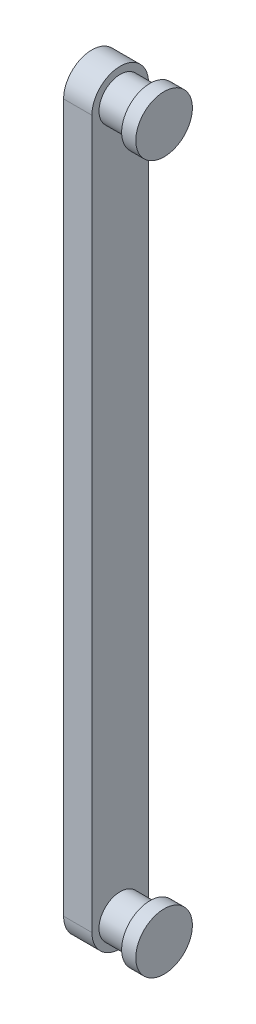
ISO-10303-21;
HEADER;
FILE_DESCRIPTION(('STEP AP214'),'2;1');
FILE_NAME('part.step','',(''),(''),'','','');
FILE_SCHEMA(('AUTOMOTIVE_DESIGN { 1 0 10303 214 1 1 1 1 }'));
ENDSEC;
DATA;
#1=APPLICATION_CONTEXT('core data for automotive mechanical design processes');
#2=APPLICATION_PROTOCOL_DEFINITION('international standard','automotive_design',2000,#1);
#3=PRODUCT_CONTEXT('',#1,'mechanical');
#4=PRODUCT('Part','Part','',(#3));
#5=PRODUCT_RELATED_PRODUCT_CATEGORY('part','',(#4));
#6=PRODUCT_DEFINITION_FORMATION('','',#4);
#7=PRODUCT_DEFINITION_CONTEXT('part definition',#1,'design');
#8=PRODUCT_DEFINITION('design','',#6,#7);
#9=PRODUCT_DEFINITION_SHAPE('','',#8);
#10=(LENGTH_UNIT() NAMED_UNIT(*) SI_UNIT(.MILLI.,.METRE.));
#11=(NAMED_UNIT(*) PLANE_ANGLE_UNIT() SI_UNIT($,.RADIAN.));
#12=(NAMED_UNIT(*) SI_UNIT($,.STERADIAN.) SOLID_ANGLE_UNIT());
#13=UNCERTAINTY_MEASURE_WITH_UNIT(LENGTH_MEASURE(1.E-05),#10,'distance_accuracy_value','');
#14=(GEOMETRIC_REPRESENTATION_CONTEXT(3) GLOBAL_UNCERTAINTY_ASSIGNED_CONTEXT((#13)) GLOBAL_UNIT_ASSIGNED_CONTEXT((#10,
#11,#12)) REPRESENTATION_CONTEXT('',''));
#15=CARTESIAN_POINT('',(0.,0.,0.));
#16=DIRECTION('',(0.,0.,1.));
#17=DIRECTION('',(1.,0.,0.));
#18=AXIS2_PLACEMENT_3D('',#15,#16,#17);
#19=CARTESIAN_POINT('',(2.,-25.,0.));
#20=DIRECTION('',(-1.,0.,0.));
#21=DIRECTION('',(0.,0.,1.));
#22=AXIS2_PLACEMENT_3D('',#19,#20,#21);
#23=PLANE('',#22);
#24=CARTESIAN_POINT('',(2.,-25.,0.));
#25=DIRECTION('',(-1.,0.,0.));
#26=DIRECTION('',(0.,0.,-1.));
#27=AXIS2_PLACEMENT_3D('',#24,#25,#26);
#28=CIRCLE('',#27,1.5);
#29=CARTESIAN_POINT('',(2.,-25.,-1.5));
#30=VERTEX_POINT('',#29);
#31=EDGE_CURVE('E166',#30,#30,#28,.T.);
#32=ORIENTED_EDGE('',*,*,#31,.T.);
#33=EDGE_LOOP('',(#32));
#34=FACE_BOUND('',#33,.T.);
#35=CARTESIAN_POINT('',(2.,-25.,0.));
#36=DIRECTION('',(1.,0.,0.));
#37=DIRECTION('',(0.,0.,1.));
#38=AXIS2_PLACEMENT_3D('',#35,#36,#37);
#39=CIRCLE('',#38,2.);
#40=CARTESIAN_POINT('',(2.,-25.,2.));
#41=VERTEX_POINT('',#40);
#42=CARTESIAN_POINT('',(2.,-25.,-2.));
#43=VERTEX_POINT('',#42);
#44=EDGE_CURVE('E85',#41,#43,#39,.T.);
#45=ORIENTED_EDGE('',*,*,#44,.T.);
#46=DIRECTION('',(0.,1.,0.));
#47=VECTOR('',#46,1.);
#48=CARTESIAN_POINT('',(2.,25.,-2.));
#49=LINE('',#48,#47);
#50=CARTESIAN_POINT('',(2.,25.,-2.));
#51=VERTEX_POINT('',#50);
#52=EDGE_CURVE('E80',#43,#51,#49,.T.);
#53=ORIENTED_EDGE('',*,*,#52,.T.);
#54=CARTESIAN_POINT('',(2.,25.,0.));
#55=DIRECTION('',(1.,0.,0.));
#56=DIRECTION('',(0.,0.,-1.));
#57=AXIS2_PLACEMENT_3D('',#54,#55,#56);
#58=CIRCLE('',#57,2.);
#59=CARTESIAN_POINT('',(2.,25.,2.));
#60=VERTEX_POINT('',#59);
#61=EDGE_CURVE('E83',#51,#60,#58,.T.);
#62=ORIENTED_EDGE('',*,*,#61,.T.);
#63=DIRECTION('',(0.,-1.,0.));
#64=VECTOR('',#63,1.);
#65=CARTESIAN_POINT('',(2.,25.,2.));
#66=LINE('',#65,#64);
#67=EDGE_CURVE('E49',#60,#41,#66,.T.);
#68=ORIENTED_EDGE('',*,*,#67,.T.);
#69=EDGE_LOOP('',(#45,#53,#62,#68));
#70=FACE_BOUND('',#69,.T.);
#71=CARTESIAN_POINT('',(2.,25.,0.));
#72=DIRECTION('',(-1.,0.,0.));
#73=DIRECTION('',(0.,0.,1.));
#74=AXIS2_PLACEMENT_3D('',#71,#72,#73);
#75=CIRCLE('',#74,1.5);
#76=CARTESIAN_POINT('',(2.,25.,1.5));
#77=VERTEX_POINT('',#76);
#78=EDGE_CURVE('E11',#77,#77,#75,.F.);
#79=ORIENTED_EDGE('',*,*,#78,.F.);
#80=EDGE_LOOP('',(#79));
#81=FACE_BOUND('',#80,.T.);
#82=ADVANCED_FACE('F32',(#34,#70,#81),#23,.F.);
#83=CARTESIAN_POINT('',(2.,-25.,0.));
#84=DIRECTION('',(-1.,0.,0.));
#85=DIRECTION('',(0.,0.,1.));
#86=AXIS2_PLACEMENT_3D('',#83,#84,#85);
#87=CYLINDRICAL_SURFACE('',#86,2.);
#88=CARTESIAN_POINT('',(0.,-25.,0.));
#89=DIRECTION('',(1.,0.,0.));
#90=DIRECTION('',(0.,0.,1.));
#91=AXIS2_PLACEMENT_3D('',#88,#89,#90);
#92=CIRCLE('',#91,2.);
#93=CARTESIAN_POINT('',(0.,-25.,2.));
#94=VERTEX_POINT('',#93);
#95=CARTESIAN_POINT('',(0.,-25.,-2.));
#96=VERTEX_POINT('',#95);
#97=EDGE_CURVE('E99',#94,#96,#92,.T.);
#98=ORIENTED_EDGE('',*,*,#97,.T.);
#99=DIRECTION('',(-1.,0.,0.));
#100=VECTOR('',#99,1.);
#101=CARTESIAN_POINT('',(2.,-25.,-2.));
#102=LINE('',#101,#100);
#103=EDGE_CURVE('E41',#43,#96,#102,.T.);
#104=ORIENTED_EDGE('',*,*,#103,.F.);
#105=ORIENTED_EDGE('',*,*,#44,.F.);
#106=DIRECTION('',(-1.,0.,0.));
#107=VECTOR('',#106,1.);
#108=CARTESIAN_POINT('',(2.,-25.,2.));
#109=LINE('',#108,#107);
#110=EDGE_CURVE('E95',#41,#94,#109,.T.);
#111=ORIENTED_EDGE('',*,*,#110,.T.);
#112=EDGE_LOOP('',(#98,#104,#105,#111));
#113=FACE_BOUND('',#112,.T.);
#114=ADVANCED_FACE('F34',(#113),#87,.T.);
#115=CARTESIAN_POINT('',(2.,25.,-2.));
#116=DIRECTION('',(0.,0.,1.));
#117=DIRECTION('',(0.,-1.,0.));
#118=AXIS2_PLACEMENT_3D('',#115,#116,#117);
#119=PLANE('',#118);
#120=DIRECTION('',(0.,1.,0.));
#121=VECTOR('',#120,1.);
#122=CARTESIAN_POINT('',(0.,25.,-2.));
#123=LINE('',#122,#121);
#124=CARTESIAN_POINT('',(0.,25.,-2.));
#125=VERTEX_POINT('',#124);
#126=EDGE_CURVE('E90',#96,#125,#123,.T.);
#127=ORIENTED_EDGE('',*,*,#126,.T.);
#128=DIRECTION('',(-1.,0.,0.));
#129=VECTOR('',#128,1.);
#130=CARTESIAN_POINT('',(2.,25.,-2.));
#131=LINE('',#130,#129);
#132=EDGE_CURVE('E88',#51,#125,#131,.T.);
#133=ORIENTED_EDGE('',*,*,#132,.F.);
#134=ORIENTED_EDGE('',*,*,#52,.F.);
#135=ORIENTED_EDGE('',*,*,#103,.T.);
#136=EDGE_LOOP('',(#127,#133,#134,#135));
#137=FACE_BOUND('',#136,.T.);
#138=ADVANCED_FACE('F89',(#137),#119,.F.);
#139=CARTESIAN_POINT('',(2.,25.,0.));
#140=DIRECTION('',(-1.,0.,0.));
#141=DIRECTION('',(0.,0.,1.));
#142=AXIS2_PLACEMENT_3D('',#139,#140,#141);
#143=CYLINDRICAL_SURFACE('',#142,2.);
#144=CARTESIAN_POINT('',(0.,25.,0.));
#145=DIRECTION('',(1.,0.,0.));
#146=DIRECTION('',(0.,0.,-1.));
#147=AXIS2_PLACEMENT_3D('',#144,#145,#146);
#148=CIRCLE('',#147,2.);
#149=CARTESIAN_POINT('',(0.,25.,2.));
#150=VERTEX_POINT('',#149);
#151=EDGE_CURVE('E66',#125,#150,#148,.T.);
#152=ORIENTED_EDGE('',*,*,#151,.T.);
#153=DIRECTION('',(-1.,0.,0.));
#154=VECTOR('',#153,1.);
#155=CARTESIAN_POINT('',(2.,25.,2.));
#156=LINE('',#155,#154);
#157=EDGE_CURVE('E91',#60,#150,#156,.T.);
#158=ORIENTED_EDGE('',*,*,#157,.F.);
#159=ORIENTED_EDGE('',*,*,#61,.F.);
#160=ORIENTED_EDGE('',*,*,#132,.T.);
#161=EDGE_LOOP('',(#152,#158,#159,#160));
#162=FACE_BOUND('',#161,.T.);
#163=ADVANCED_FACE('F93',(#162),#143,.T.);
#164=CARTESIAN_POINT('',(2.,25.,2.));
#165=DIRECTION('',(0.,0.,-1.));
#166=DIRECTION('',(0.,1.,0.));
#167=AXIS2_PLACEMENT_3D('',#164,#165,#166);
#168=PLANE('',#167);
#169=DIRECTION('',(0.,-1.,0.));
#170=VECTOR('',#169,1.);
#171=CARTESIAN_POINT('',(0.,25.,2.));
#172=LINE('',#171,#170);
#173=EDGE_CURVE('E72',#150,#94,#172,.T.);
#174=ORIENTED_EDGE('',*,*,#173,.T.);
#175=ORIENTED_EDGE('',*,*,#110,.F.);
#176=ORIENTED_EDGE('',*,*,#67,.F.);
#177=ORIENTED_EDGE('',*,*,#157,.T.);
#178=EDGE_LOOP('',(#174,#175,#176,#177));
#179=FACE_BOUND('',#178,.T.);
#180=ADVANCED_FACE('F113',(#179),#168,.F.);
#181=CARTESIAN_POINT('',(0.,-25.,0.));
#182=DIRECTION('',(-1.,0.,0.));
#183=DIRECTION('',(0.,0.,1.));
#184=AXIS2_PLACEMENT_3D('',#181,#182,#183);
#185=PLANE('',#184);
#186=ORIENTED_EDGE('',*,*,#97,.F.);
#187=ORIENTED_EDGE('',*,*,#173,.F.);
#188=ORIENTED_EDGE('',*,*,#151,.F.);
#189=ORIENTED_EDGE('',*,*,#126,.F.);
#190=EDGE_LOOP('',(#186,#187,#188,#189));
#191=FACE_BOUND('',#190,.T.);
#192=ADVANCED_FACE('F110',(#191),#185,.T.);
#193=CARTESIAN_POINT('',(4.1,25.,0.));
#194=DIRECTION('',(-1.,0.,0.));
#195=DIRECTION('',(0.,0.,1.));
#196=AXIS2_PLACEMENT_3D('',#193,#194,#195);
#197=CYLINDRICAL_SURFACE('',#196,1.5);
#198=CARTESIAN_POINT('',(4.1,25.,0.));
#199=DIRECTION('',(1.,0.,0.));
#200=DIRECTION('',(0.,0.,-1.));
#201=AXIS2_PLACEMENT_3D('',#198,#199,#200);
#202=CIRCLE('',#201,1.5);
#203=CARTESIAN_POINT('',(4.1,25.,-1.5));
#204=VERTEX_POINT('',#203);
#205=EDGE_CURVE('E102',#204,#204,#202,.T.);
#206=ORIENTED_EDGE('',*,*,#205,.F.);
#207=EDGE_LOOP('',(#206));
#208=FACE_BOUND('',#207,.T.);
#209=ORIENTED_EDGE('',*,*,#78,.T.);
#210=EDGE_LOOP('',(#209));
#211=FACE_BOUND('',#210,.T.);
#212=ADVANCED_FACE('F112',(#208,#211),#197,.T.);
#213=CARTESIAN_POINT('',(4.1,25.,0.));
#214=DIRECTION('',(1.,0.,0.));
#215=DIRECTION('',(0.,0.,-1.));
#216=AXIS2_PLACEMENT_3D('',#213,#214,#215);
#217=PLANE('',#216);
#218=CARTESIAN_POINT('',(4.1,25.,0.));
#219=DIRECTION('',(1.,0.,0.));
#220=DIRECTION('',(0.,0.,-1.));
#221=AXIS2_PLACEMENT_3D('',#218,#219,#220);
#222=CIRCLE('',#221,2.);
#223=CARTESIAN_POINT('',(4.1,25.,-2.));
#224=VERTEX_POINT('',#223);
#225=EDGE_CURVE('E172',#224,#224,#222,.T.);
#226=ORIENTED_EDGE('',*,*,#225,.F.);
#227=EDGE_LOOP('',(#226));
#228=FACE_BOUND('',#227,.T.);
#229=ORIENTED_EDGE('',*,*,#205,.T.);
#230=EDGE_LOOP('',(#229));
#231=FACE_BOUND('',#230,.T.);
#232=ADVANCED_FACE('F119',(#228,#231),#217,.F.);
#233=CARTESIAN_POINT('',(5.1,25.,0.));
#234=DIRECTION('',(-1.,0.,0.));
#235=DIRECTION('',(0.,0.,1.));
#236=AXIS2_PLACEMENT_3D('',#233,#234,#235);
#237=CYLINDRICAL_SURFACE('',#236,2.);
#238=CARTESIAN_POINT('',(5.1,25.,0.));
#239=DIRECTION('',(1.,0.,0.));
#240=DIRECTION('',(0.,0.,-1.));
#241=AXIS2_PLACEMENT_3D('',#238,#239,#240);
#242=CIRCLE('',#241,2.);
#243=CARTESIAN_POINT('',(5.1,25.,-2.));
#244=VERTEX_POINT('',#243);
#245=EDGE_CURVE('E173',#244,#244,#242,.T.);
#246=ORIENTED_EDGE('',*,*,#245,.F.);
#247=EDGE_LOOP('',(#246));
#248=FACE_BOUND('',#247,.T.);
#249=ORIENTED_EDGE('',*,*,#225,.T.);
#250=EDGE_LOOP('',(#249));
#251=FACE_BOUND('',#250,.T.);
#252=ADVANCED_FACE('F131',(#248,#251),#237,.T.);
#253=CARTESIAN_POINT('',(5.1,25.,0.));
#254=DIRECTION('',(1.,0.,0.));
#255=DIRECTION('',(0.,0.,-1.));
#256=AXIS2_PLACEMENT_3D('',#253,#254,#255);
#257=PLANE('',#256);
#258=ORIENTED_EDGE('',*,*,#245,.T.);
#259=EDGE_LOOP('',(#258));
#260=FACE_BOUND('',#259,.T.);
#261=ADVANCED_FACE('F134',(#260),#257,.T.);
#262=CARTESIAN_POINT('',(4.1,-25.,0.));
#263=DIRECTION('',(-1.,0.,0.));
#264=DIRECTION('',(0.,0.,1.));
#265=AXIS2_PLACEMENT_3D('',#262,#263,#264);
#266=CYLINDRICAL_SURFACE('',#265,1.5);
#267=CARTESIAN_POINT('',(4.1,-25.,0.));
#268=DIRECTION('',(1.,0.,0.));
#269=DIRECTION('',(0.,0.,-1.));
#270=AXIS2_PLACEMENT_3D('',#267,#268,#269);
#271=CIRCLE('',#270,1.5);
#272=CARTESIAN_POINT('',(4.1,-25.,-1.5));
#273=VERTEX_POINT('',#272);
#274=EDGE_CURVE('E162',#273,#273,#271,.F.);
#275=ORIENTED_EDGE('',*,*,#274,.T.);
#276=EDGE_LOOP('',(#275));
#277=FACE_BOUND('',#276,.T.);
#278=ORIENTED_EDGE('',*,*,#31,.F.);
#279=EDGE_LOOP('',(#278));
#280=FACE_BOUND('',#279,.T.);
#281=ADVANCED_FACE('F141',(#277,#280),#266,.T.);
#282=CARTESIAN_POINT('',(5.1,-25.,0.));
#283=DIRECTION('',(-1.,0.,0.));
#284=DIRECTION('',(0.,0.,1.));
#285=AXIS2_PLACEMENT_3D('',#282,#283,#284);
#286=CYLINDRICAL_SURFACE('',#285,2.);
#287=CARTESIAN_POINT('',(5.1,-25.,0.));
#288=DIRECTION('',(-1.,0.,0.));
#289=DIRECTION('',(0.,0.,-1.));
#290=AXIS2_PLACEMENT_3D('',#287,#288,#289);
#291=CIRCLE('',#290,2.);
#292=CARTESIAN_POINT('',(5.1,-25.,-2.));
#293=VERTEX_POINT('',#292);
#294=EDGE_CURVE('E161',#293,#293,#291,.T.);
#295=ORIENTED_EDGE('',*,*,#294,.T.);
#296=EDGE_LOOP('',(#295));
#297=FACE_BOUND('',#296,.T.);
#298=CARTESIAN_POINT('',(4.1,-25.,0.));
#299=DIRECTION('',(-1.,0.,0.));
#300=DIRECTION('',(0.,0.,-1.));
#301=AXIS2_PLACEMENT_3D('',#298,#299,#300);
#302=CIRCLE('',#301,2.);
#303=CARTESIAN_POINT('',(4.1,-25.,-2.));
#304=VERTEX_POINT('',#303);
#305=EDGE_CURVE('E163',#304,#304,#302,.T.);
#306=ORIENTED_EDGE('',*,*,#305,.F.);
#307=EDGE_LOOP('',(#306));
#308=FACE_BOUND('',#307,.T.);
#309=ADVANCED_FACE('F145',(#297,#308),#286,.T.);
#310=CARTESIAN_POINT('',(5.1,-25.,0.));
#311=DIRECTION('',(1.,0.,0.));
#312=DIRECTION('',(0.,0.,-1.));
#313=AXIS2_PLACEMENT_3D('',#310,#311,#312);
#314=PLANE('',#313);
#315=ORIENTED_EDGE('',*,*,#294,.F.);
#316=EDGE_LOOP('',(#315));
#317=FACE_BOUND('',#316,.T.);
#318=ADVANCED_FACE('F149',(#317),#314,.T.);
#319=CARTESIAN_POINT('',(4.1,-25.,0.));
#320=DIRECTION('',(1.,0.,0.));
#321=DIRECTION('',(0.,0.,-1.));
#322=AXIS2_PLACEMENT_3D('',#319,#320,#321);
#323=PLANE('',#322);
#324=ORIENTED_EDGE('',*,*,#274,.F.);
#325=EDGE_LOOP('',(#324));
#326=FACE_BOUND('',#325,.T.);
#327=ORIENTED_EDGE('',*,*,#305,.T.);
#328=EDGE_LOOP('',(#327));
#329=FACE_BOUND('',#328,.T.);
#330=ADVANCED_FACE('F151',(#326,#329),#323,.F.);
#331=CLOSED_SHELL('',(#82,#114,#138,#163,#180,#192,#212,#232,#252,#261,#281,#309,#318,#330));
#332=MANIFOLD_SOLID_BREP('B2',#331);
#333=ADVANCED_BREP_SHAPE_REPRESENTATION('',(#18,#332),#14);
#334=SHAPE_DEFINITION_REPRESENTATION(#9,#333);
ENDSEC;
END-ISO-10303-21;
